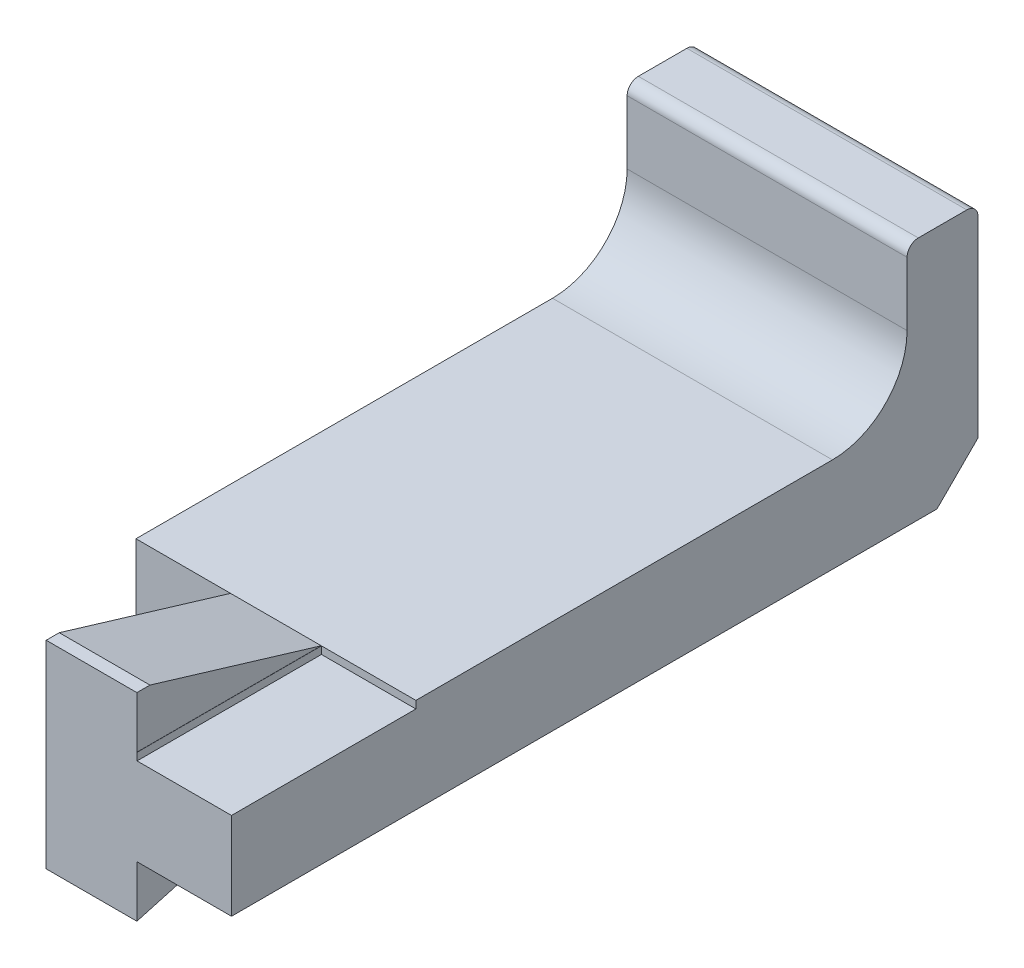
ISO-10303-21;
HEADER;
FILE_DESCRIPTION(('STEP AP214'),'2;1');
FILE_NAME('part.step','',(''),(''),'','','');
FILE_SCHEMA(('AUTOMOTIVE_DESIGN { 1 0 10303 214 1 1 1 1 }'));
ENDSEC;
DATA;
#1=APPLICATION_CONTEXT('core data for automotive mechanical design processes');
#2=APPLICATION_PROTOCOL_DEFINITION('international standard','automotive_design',2000,#1);
#3=PRODUCT_CONTEXT('',#1,'mechanical');
#4=PRODUCT('Part','Part','',(#3));
#5=PRODUCT_RELATED_PRODUCT_CATEGORY('part','',(#4));
#6=PRODUCT_DEFINITION_FORMATION('','',#4);
#7=PRODUCT_DEFINITION_CONTEXT('part definition',#1,'design');
#8=PRODUCT_DEFINITION('design','',#6,#7);
#9=PRODUCT_DEFINITION_SHAPE('','',#8);
#10=(LENGTH_UNIT() NAMED_UNIT(*) SI_UNIT(.MILLI.,.METRE.));
#11=(NAMED_UNIT(*) PLANE_ANGLE_UNIT() SI_UNIT($,.RADIAN.));
#12=(NAMED_UNIT(*) SI_UNIT($,.STERADIAN.) SOLID_ANGLE_UNIT());
#13=UNCERTAINTY_MEASURE_WITH_UNIT(LENGTH_MEASURE(1.E-05),#10,'distance_accuracy_value','');
#14=(GEOMETRIC_REPRESENTATION_CONTEXT(3) GLOBAL_UNCERTAINTY_ASSIGNED_CONTEXT((#13)) GLOBAL_UNIT_ASSIGNED_CONTEXT((#10,
#11,#12)) REPRESENTATION_CONTEXT('',''));
#15=CARTESIAN_POINT('',(0.,0.,0.));
#16=DIRECTION('',(0.,0.,1.));
#17=DIRECTION('',(1.,0.,0.));
#18=AXIS2_PLACEMENT_3D('',#15,#16,#17);
#19=CARTESIAN_POINT('',(-3.0988,6.4516,0.));
#20=DIRECTION('',(-1.,0.,0.));
#21=DIRECTION('',(0.,0.,1.));
#22=AXIS2_PLACEMENT_3D('',#19,#20,#21);
#23=PLANE('',#22);
#24=DIRECTION('',(0.,0.,-1.));
#25=VECTOR('',#24,1.);
#26=CARTESIAN_POINT('',(-3.0988,0.,0.));
#27=LINE('',#26,#25);
#28=CARTESIAN_POINT('',(-3.0988,0.,25.4));
#29=VERTEX_POINT('',#28);
#30=CARTESIAN_POINT('',(-3.0988,0.,12.8524));
#31=VERTEX_POINT('',#30);
#32=EDGE_CURVE('E450',#29,#31,#27,.T.);
#33=ORIENTED_EDGE('',*,*,#32,.F.);
#34=DIRECTION('',(0.,-1.,0.));
#35=VECTOR('',#34,1.);
#36=CARTESIAN_POINT('',(-3.0988,6.4516,25.4));
#37=LINE('',#36,#35);
#38=CARTESIAN_POINT('',(-3.0988,6.4516,25.4));
#39=VERTEX_POINT('',#38);
#40=EDGE_CURVE('E506',#39,#29,#37,.T.);
#41=ORIENTED_EDGE('',*,*,#40,.F.);
#42=DIRECTION('',(0.,0.,-1.));
#43=VECTOR('',#42,1.);
#44=CARTESIAN_POINT('',(-3.0988,6.4516,0.));
#45=LINE('',#44,#43);
#46=CARTESIAN_POINT('',(-3.0988,6.4516,12.8524));
#47=VERTEX_POINT('',#46);
#48=EDGE_CURVE('E451',#39,#47,#45,.T.);
#49=ORIENTED_EDGE('',*,*,#48,.T.);
#50=DIRECTION('',(0.,-1.,0.));
#51=VECTOR('',#50,1.);
#52=CARTESIAN_POINT('',(-3.0988,6.4516,12.8524));
#53=LINE('',#52,#51);
#54=EDGE_CURVE('E471',#47,#31,#53,.T.);
#55=ORIENTED_EDGE('',*,*,#54,.T.);
#56=EDGE_LOOP('',(#33,#41,#49,#55));
#57=FACE_BOUND('',#56,.T.);
#58=ADVANCED_FACE('F43',(#57),#23,.T.);
#59=CARTESIAN_POINT('',(0.,6.4516,25.4));
#60=DIRECTION('',(0.,0.,-1.));
#61=DIRECTION('',(-1.,0.,0.));
#62=AXIS2_PLACEMENT_3D('',#59,#60,#61);
#63=PLANE('',#62);
#64=DIRECTION('',(1.,0.,0.));
#65=VECTOR('',#64,1.);
#66=CARTESIAN_POINT('',(9.525,5.9436,25.4));
#67=LINE('',#66,#65);
#68=CARTESIAN_POINT('',(3.0988,5.9436,25.4));
#69=VERTEX_POINT('',#68);
#70=CARTESIAN_POINT('',(9.525,5.9436,25.4));
#71=VERTEX_POINT('',#70);
#72=EDGE_CURVE('E417',#69,#71,#67,.T.);
#73=ORIENTED_EDGE('',*,*,#72,.F.);
#74=DIRECTION('',(0.,1.,0.));
#75=VECTOR('',#74,1.);
#76=CARTESIAN_POINT('',(3.0988,5.9436,25.4));
#77=LINE('',#76,#75);
#78=CARTESIAN_POINT('',(3.0988,6.4516,25.4));
#79=VERTEX_POINT('',#78);
#80=EDGE_CURVE('E427',#69,#79,#77,.T.);
#81=ORIENTED_EDGE('',*,*,#80,.T.);
#82=DIRECTION('',(1.,0.,0.));
#83=VECTOR('',#82,1.);
#84=CARTESIAN_POINT('',(0.,6.4516,25.4));
#85=LINE('',#84,#83);
#86=CARTESIAN_POINT('',(3.0861,6.4516,25.4));
#87=VERTEX_POINT('',#86);
#88=EDGE_CURVE('E455',#87,#79,#85,.T.);
#89=ORIENTED_EDGE('',*,*,#88,.F.);
#90=DIRECTION('',(0.,-1.,0.));
#91=VECTOR('',#90,1.);
#92=CARTESIAN_POINT('',(3.0861,9.96315,25.4));
#93=LINE('',#92,#91);
#94=CARTESIAN_POINT('',(3.0861,9.96315,25.4));
#95=VERTEX_POINT('',#94);
#96=EDGE_CURVE('E366',#95,#87,#93,.T.);
#97=ORIENTED_EDGE('',*,*,#96,.F.);
#98=DIRECTION('',(-1.,0.,0.));
#99=VECTOR('',#98,1.);
#100=CARTESIAN_POINT('',(3.0861,9.96315,25.4));
#101=LINE('',#100,#99);
#102=CARTESIAN_POINT('',(-3.0861,9.96315,25.4));
#103=VERTEX_POINT('',#102);
#104=EDGE_CURVE('E379',#95,#103,#101,.T.);
#105=ORIENTED_EDGE('',*,*,#104,.T.);
#106=DIRECTION('',(0.,-1.,0.));
#107=VECTOR('',#106,1.);
#108=CARTESIAN_POINT('',(-3.0861,9.96315,25.4));
#109=LINE('',#108,#107);
#110=CARTESIAN_POINT('',(-3.0861,6.4516,25.4));
#111=VERTEX_POINT('',#110);
#112=EDGE_CURVE('E365',#103,#111,#109,.T.);
#113=ORIENTED_EDGE('',*,*,#112,.T.);
#114=EDGE_CURVE('E457',#39,#111,#85,.T.);
#115=ORIENTED_EDGE('',*,*,#114,.F.);
#116=ORIENTED_EDGE('',*,*,#40,.T.);
#117=DIRECTION('',(1.,0.,0.));
#118=VECTOR('',#117,1.);
#119=CARTESIAN_POINT('',(0.,0.,25.4));
#120=LINE('',#119,#118);
#121=CARTESIAN_POINT('',(-3.0861,0.,25.4));
#122=VERTEX_POINT('',#121);
#123=EDGE_CURVE('E476',#29,#122,#120,.T.);
#124=ORIENTED_EDGE('',*,*,#123,.T.);
#125=DIRECTION('',(0.,-1.,0.));
#126=VECTOR('',#125,1.);
#127=CARTESIAN_POINT('',(-3.0861,0.,25.4));
#128=LINE('',#127,#126);
#129=CARTESIAN_POINT('',(-3.0861,-3.51155,25.4));
#130=VERTEX_POINT('',#129);
#131=EDGE_CURVE('E352',#122,#130,#128,.T.);
#132=ORIENTED_EDGE('',*,*,#131,.T.);
#133=DIRECTION('',(-1.,0.,0.));
#134=VECTOR('',#133,1.);
#135=CARTESIAN_POINT('',(3.0861,-3.51155,25.4));
#136=LINE('',#135,#134);
#137=CARTESIAN_POINT('',(3.0861,-3.51155,25.4));
#138=VERTEX_POINT('',#137);
#139=EDGE_CURVE('E361',#138,#130,#136,.T.);
#140=ORIENTED_EDGE('',*,*,#139,.F.);
#141=DIRECTION('',(0.,-1.,0.));
#142=VECTOR('',#141,1.);
#143=CARTESIAN_POINT('',(3.0861,0.,25.4));
#144=LINE('',#143,#142);
#145=CARTESIAN_POINT('',(3.0861,0.,25.4));
#146=VERTEX_POINT('',#145);
#147=EDGE_CURVE('E341',#146,#138,#144,.T.);
#148=ORIENTED_EDGE('',*,*,#147,.F.);
#149=CARTESIAN_POINT('',(9.525,0.,25.4));
#150=VERTEX_POINT('',#149);
#151=EDGE_CURVE('E475',#146,#150,#120,.T.);
#152=ORIENTED_EDGE('',*,*,#151,.T.);
#153=DIRECTION('',(0.,-1.,0.));
#154=VECTOR('',#153,1.);
#155=CARTESIAN_POINT('',(9.525,6.4516,25.4));
#156=LINE('',#155,#154);
#157=EDGE_CURVE('E502',#71,#150,#156,.T.);
#158=ORIENTED_EDGE('',*,*,#157,.F.);
#159=EDGE_LOOP('',(#73,#81,#89,#97,#105,#113,#115,#116,#124,#132,#140,#148,#152,#158));
#160=FACE_BOUND('',#159,.T.);
#161=ADVANCED_FACE('F563',(#160),#63,.F.);
#162=CARTESIAN_POINT('',(9.525,6.4516,0.));
#163=DIRECTION('',(-1.,0.,0.));
#164=DIRECTION('',(0.,0.,1.));
#165=AXIS2_PLACEMENT_3D('',#162,#163,#164);
#166=PLANE('',#165);
#167=DIRECTION('',(0.,0.,-1.));
#168=VECTOR('',#167,1.);
#169=CARTESIAN_POINT('',(9.525,0.,0.));
#170=LINE('',#169,#168);
#171=CARTESIAN_POINT('',(9.525,0.,-22.606));
#172=VERTEX_POINT('',#171);
#173=EDGE_CURVE('E480',#150,#172,#170,.T.);
#174=ORIENTED_EDGE('',*,*,#173,.T.);
#175=DIRECTION('',(0.,0.707106781186549,-0.707106781186546));
#176=VECTOR('',#175,1.);
#177=CARTESIAN_POINT('',(9.525,0.,-22.606));
#178=LINE('',#177,#176);
#179=CARTESIAN_POINT('',(9.525,2.794,-25.4));
#180=VERTEX_POINT('',#179);
#181=EDGE_CURVE('E554',#172,#180,#178,.T.);
#182=ORIENTED_EDGE('',*,*,#181,.T.);
#183=DIRECTION('',(0.,-1.,0.));
#184=VECTOR('',#183,1.);
#185=CARTESIAN_POINT('',(9.525,6.4516,-25.4));
#186=LINE('',#185,#184);
#187=CARTESIAN_POINT('',(9.525,15.8496,-25.4));
#188=VERTEX_POINT('',#187);
#189=EDGE_CURVE('E499',#188,#180,#186,.T.);
#190=ORIENTED_EDGE('',*,*,#189,.F.);
#191=CARTESIAN_POINT('',(9.525,15.8496,-24.638));
#192=DIRECTION('',(-1.,0.,0.));
#193=DIRECTION('',(0.,0.,1.));
#194=AXIS2_PLACEMENT_3D('',#191,#192,#193);
#195=CIRCLE('',#194,0.762);
#196=CARTESIAN_POINT('',(9.525,16.6116,-24.638));
#197=VERTEX_POINT('',#196);
#198=EDGE_CURVE('E544',#188,#197,#195,.F.);
#199=ORIENTED_EDGE('',*,*,#198,.T.);
#200=DIRECTION('',(0.,0.,-1.));
#201=VECTOR('',#200,1.);
#202=CARTESIAN_POINT('',(9.525,16.6116,-25.4));
#203=LINE('',#202,#201);
#204=CARTESIAN_POINT('',(9.525,16.6116,-21.336));
#205=VERTEX_POINT('',#204);
#206=EDGE_CURVE('E440',#205,#197,#203,.T.);
#207=ORIENTED_EDGE('',*,*,#206,.F.);
#208=CARTESIAN_POINT('',(9.525,15.8496,-21.336));
#209=DIRECTION('',(-1.,0.,0.));
#210=DIRECTION('',(0.,0.,1.));
#211=AXIS2_PLACEMENT_3D('',#208,#209,#210);
#212=CIRCLE('',#211,0.762);
#213=CARTESIAN_POINT('',(9.525,15.8496,-20.574));
#214=VERTEX_POINT('',#213);
#215=EDGE_CURVE('E541',#205,#214,#212,.F.);
#216=ORIENTED_EDGE('',*,*,#215,.T.);
#217=DIRECTION('',(0.,-1.,0.));
#218=VECTOR('',#217,1.);
#219=CARTESIAN_POINT('',(9.525,16.6116,-20.574));
#220=LINE('',#219,#218);
#221=CARTESIAN_POINT('',(9.525,11.5316,-20.574));
#222=VERTEX_POINT('',#221);
#223=EDGE_CURVE('E444',#214,#222,#220,.T.);
#224=ORIENTED_EDGE('',*,*,#223,.T.);
#225=CARTESIAN_POINT('',(9.525,11.5316,-15.494));
#226=DIRECTION('',(-1.,0.,0.));
#227=DIRECTION('',(0.,0.,1.));
#228=AXIS2_PLACEMENT_3D('',#225,#226,#227);
#229=CIRCLE('',#228,5.08);
#230=CARTESIAN_POINT('',(9.525,6.4516,-15.494));
#231=VERTEX_POINT('',#230);
#232=EDGE_CURVE('E516',#222,#231,#229,.T.);
#233=ORIENTED_EDGE('',*,*,#232,.T.);
#234=DIRECTION('',(0.,0.,-1.));
#235=VECTOR('',#234,1.);
#236=CARTESIAN_POINT('',(9.525,6.4516,0.));
#237=LINE('',#236,#235);
#238=CARTESIAN_POINT('',(9.525,6.4516,12.8524));
#239=VERTEX_POINT('',#238);
#240=EDGE_CURVE('E461',#239,#231,#237,.T.);
#241=ORIENTED_EDGE('',*,*,#240,.F.);
#242=DIRECTION('',(0.,1.,0.));
#243=VECTOR('',#242,1.);
#244=CARTESIAN_POINT('',(9.525,5.9436,12.8524));
#245=LINE('',#244,#243);
#246=CARTESIAN_POINT('',(9.525,5.9436,12.8524));
#247=VERTEX_POINT('',#246);
#248=EDGE_CURVE('E420',#247,#239,#245,.T.);
#249=ORIENTED_EDGE('',*,*,#248,.F.);
#250=DIRECTION('',(0.,0.,-1.));
#251=VECTOR('',#250,1.);
#252=CARTESIAN_POINT('',(9.525,5.9436,25.4));
#253=LINE('',#252,#251);
#254=EDGE_CURVE('E404',#71,#247,#253,.T.);
#255=ORIENTED_EDGE('',*,*,#254,.F.);
#256=ORIENTED_EDGE('',*,*,#157,.T.);
#257=EDGE_LOOP('',(#174,#182,#190,#199,#207,#216,#224,#233,#241,#249,#255,#256));
#258=FACE_BOUND('',#257,.T.);
#259=ADVANCED_FACE('F570',(#258),#166,.F.);
#260=CARTESIAN_POINT('',(0.,6.4516,-25.4));
#261=DIRECTION('',(0.,0.,-1.));
#262=DIRECTION('',(-1.,0.,0.));
#263=AXIS2_PLACEMENT_3D('',#260,#261,#262);
#264=PLANE('',#263);
#265=ORIENTED_EDGE('',*,*,#189,.T.);
#266=DIRECTION('',(-1.,0.,0.));
#267=VECTOR('',#266,1.);
#268=CARTESIAN_POINT('',(-9.525,2.794,-25.4));
#269=LINE('',#268,#267);
#270=CARTESIAN_POINT('',(-9.525,2.794,-25.4));
#271=VERTEX_POINT('',#270);
#272=EDGE_CURVE('E53',#180,#271,#269,.T.);
#273=ORIENTED_EDGE('',*,*,#272,.T.);
#274=DIRECTION('',(0.,-1.,0.));
#275=VECTOR('',#274,1.);
#276=CARTESIAN_POINT('',(-9.525,6.4516,-25.4));
#277=LINE('',#276,#275);
#278=CARTESIAN_POINT('',(-9.525,15.8496,-25.4));
#279=VERTEX_POINT('',#278);
#280=EDGE_CURVE('E496',#279,#271,#277,.T.);
#281=ORIENTED_EDGE('',*,*,#280,.F.);
#282=DIRECTION('',(-1.,0.,0.));
#283=VECTOR('',#282,1.);
#284=CARTESIAN_POINT('',(0.,15.8496,-25.4));
#285=LINE('',#284,#283);
#286=EDGE_CURVE('E538',#279,#188,#285,.F.);
#287=ORIENTED_EDGE('',*,*,#286,.T.);
#288=EDGE_LOOP('',(#265,#273,#281,#287));
#289=FACE_BOUND('',#288,.T.);
#290=ADVANCED_FACE('F580',(#289),#264,.T.);
#291=CARTESIAN_POINT('',(-9.525,6.4516,0.));
#292=DIRECTION('',(-1.,0.,0.));
#293=DIRECTION('',(0.,0.,1.));
#294=AXIS2_PLACEMENT_3D('',#291,#292,#293);
#295=PLANE('',#294);
#296=ORIENTED_EDGE('',*,*,#280,.T.);
#297=DIRECTION('',(0.,-0.707106781186549,0.707106781186546));
#298=VECTOR('',#297,1.);
#299=CARTESIAN_POINT('',(-9.525,-8.07719999999999,-14.5288000000001));
#300=LINE('',#299,#298);
#301=CARTESIAN_POINT('',(-9.525,0.,-22.606));
#302=VERTEX_POINT('',#301);
#303=EDGE_CURVE('E11',#271,#302,#300,.T.);
#304=ORIENTED_EDGE('',*,*,#303,.T.);
#305=DIRECTION('',(0.,0.,-1.));
#306=VECTOR('',#305,1.);
#307=CARTESIAN_POINT('',(-9.525,0.,0.));
#308=LINE('',#307,#306);
#309=CARTESIAN_POINT('',(-9.525,0.,12.8524));
#310=VERTEX_POINT('',#309);
#311=EDGE_CURVE('E484',#310,#302,#308,.T.);
#312=ORIENTED_EDGE('',*,*,#311,.F.);
#313=DIRECTION('',(0.,-1.,0.));
#314=VECTOR('',#313,1.);
#315=CARTESIAN_POINT('',(-9.525,6.4516,12.8524));
#316=LINE('',#315,#314);
#317=CARTESIAN_POINT('',(-9.525,6.4516,12.8524));
#318=VERTEX_POINT('',#317);
#319=EDGE_CURVE('E493',#318,#310,#316,.T.);
#320=ORIENTED_EDGE('',*,*,#319,.F.);
#321=DIRECTION('',(0.,0.,-1.));
#322=VECTOR('',#321,1.);
#323=CARTESIAN_POINT('',(-9.525,6.4516,0.));
#324=LINE('',#323,#322);
#325=CARTESIAN_POINT('',(-9.525,6.4516,-15.494));
#326=VERTEX_POINT('',#325);
#327=EDGE_CURVE('E464',#318,#326,#324,.T.);
#328=ORIENTED_EDGE('',*,*,#327,.T.);
#329=CARTESIAN_POINT('',(-9.525,11.5316,-15.494));
#330=DIRECTION('',(-1.,0.,0.));
#331=DIRECTION('',(0.,0.,1.));
#332=AXIS2_PLACEMENT_3D('',#329,#330,#331);
#333=CIRCLE('',#332,5.08);
#334=CARTESIAN_POINT('',(-9.525,11.5316,-20.574));
#335=VERTEX_POINT('',#334);
#336=EDGE_CURVE('E520',#326,#335,#333,.F.);
#337=ORIENTED_EDGE('',*,*,#336,.T.);
#338=DIRECTION('',(0.,-1.,0.));
#339=VECTOR('',#338,1.);
#340=CARTESIAN_POINT('',(-9.525,16.6116,-20.574));
#341=LINE('',#340,#339);
#342=CARTESIAN_POINT('',(-9.525,15.8496,-20.574));
#343=VERTEX_POINT('',#342);
#344=EDGE_CURVE('E447',#343,#335,#341,.T.);
#345=ORIENTED_EDGE('',*,*,#344,.F.);
#346=CARTESIAN_POINT('',(-9.525,15.8496,-21.336));
#347=DIRECTION('',(-1.,0.,0.));
#348=DIRECTION('',(0.,0.,1.));
#349=AXIS2_PLACEMENT_3D('',#346,#347,#348);
#350=CIRCLE('',#349,0.762);
#351=CARTESIAN_POINT('',(-9.525,16.6116,-21.336));
#352=VERTEX_POINT('',#351);
#353=EDGE_CURVE('E532',#343,#352,#350,.T.);
#354=ORIENTED_EDGE('',*,*,#353,.T.);
#355=DIRECTION('',(0.,0.,1.));
#356=VECTOR('',#355,1.);
#357=CARTESIAN_POINT('',(-9.525,16.6116,-25.4));
#358=LINE('',#357,#356);
#359=CARTESIAN_POINT('',(-9.525,16.6116,-24.638));
#360=VERTEX_POINT('',#359);
#361=EDGE_CURVE('E431',#360,#352,#358,.T.);
#362=ORIENTED_EDGE('',*,*,#361,.F.);
#363=CARTESIAN_POINT('',(-9.525,15.8496,-24.638));
#364=DIRECTION('',(-1.,0.,0.));
#365=DIRECTION('',(0.,0.,1.));
#366=AXIS2_PLACEMENT_3D('',#363,#364,#365);
#367=CIRCLE('',#366,0.762);
#368=EDGE_CURVE('E535',#360,#279,#367,.T.);
#369=ORIENTED_EDGE('',*,*,#368,.T.);
#370=EDGE_LOOP('',(#296,#304,#312,#320,#328,#337,#345,#354,#362,#369));
#371=FACE_BOUND('',#370,.T.);
#372=ADVANCED_FACE('F777',(#371),#295,.T.);
#373=CARTESIAN_POINT('',(0.,6.4516,12.8524));
#374=DIRECTION('',(0.,0.,-1.));
#375=DIRECTION('',(-1.,0.,0.));
#376=AXIS2_PLACEMENT_3D('',#373,#374,#375);
#377=PLANE('',#376);
#378=DIRECTION('',(1.,0.,0.));
#379=VECTOR('',#378,1.);
#380=CARTESIAN_POINT('',(0.,0.,12.8524));
#381=LINE('',#380,#379);
#382=EDGE_CURVE('E456',#310,#31,#381,.T.);
#383=ORIENTED_EDGE('',*,*,#382,.T.);
#384=ORIENTED_EDGE('',*,*,#54,.F.);
#385=DIRECTION('',(1.,0.,0.));
#386=VECTOR('',#385,1.);
#387=CARTESIAN_POINT('',(0.,6.4516,12.8524));
#388=LINE('',#387,#386);
#389=EDGE_CURVE('E468',#318,#47,#388,.T.);
#390=ORIENTED_EDGE('',*,*,#389,.F.);
#391=ORIENTED_EDGE('',*,*,#319,.T.);
#392=EDGE_LOOP('',(#383,#384,#390,#391));
#393=FACE_BOUND('',#392,.T.);
#394=ADVANCED_FACE('F688',(#393),#377,.F.);
#395=CARTESIAN_POINT('',(0.,6.4516,0.));
#396=DIRECTION('',(0.,1.,0.));
#397=DIRECTION('',(0.,0.,1.));
#398=AXIS2_PLACEMENT_3D('',#395,#396,#397);
#399=PLANE('',#398);
#400=DIRECTION('',(0.,0.,-1.));
#401=VECTOR('',#400,1.);
#402=CARTESIAN_POINT('',(3.0861,6.4516,25.4));
#403=LINE('',#402,#401);
#404=CARTESIAN_POINT('',(3.0861,6.4516,12.8524));
#405=VERTEX_POINT('',#404);
#406=EDGE_CURVE('E369',#87,#405,#403,.T.);
#407=ORIENTED_EDGE('',*,*,#406,.F.);
#408=ORIENTED_EDGE('',*,*,#88,.T.);
#409=DIRECTION('',(0.,0.,1.));
#410=VECTOR('',#409,1.);
#411=CARTESIAN_POINT('',(3.0988,6.4516,25.4));
#412=LINE('',#411,#410);
#413=CARTESIAN_POINT('',(3.0988,6.4516,12.8524));
#414=VERTEX_POINT('',#413);
#415=EDGE_CURVE('E409',#414,#79,#412,.T.);
#416=ORIENTED_EDGE('',*,*,#415,.F.);
#417=DIRECTION('',(-1.,0.,0.));
#418=VECTOR('',#417,1.);
#419=CARTESIAN_POINT('',(9.525,6.4516,12.8524));
#420=LINE('',#419,#418);
#421=EDGE_CURVE('E403',#239,#414,#420,.T.);
#422=ORIENTED_EDGE('',*,*,#421,.F.);
#423=ORIENTED_EDGE('',*,*,#240,.T.);
#424=DIRECTION('',(1.,0.,0.));
#425=VECTOR('',#424,1.);
#426=CARTESIAN_POINT('',(0.,6.4516,-15.494));
#427=LINE('',#426,#425);
#428=EDGE_CURVE('E513',#231,#326,#427,.F.);
#429=ORIENTED_EDGE('',*,*,#428,.T.);
#430=ORIENTED_EDGE('',*,*,#327,.F.);
#431=ORIENTED_EDGE('',*,*,#389,.T.);
#432=ORIENTED_EDGE('',*,*,#48,.F.);
#433=ORIENTED_EDGE('',*,*,#114,.T.);
#434=DIRECTION('',(0.,0.,-1.));
#435=VECTOR('',#434,1.);
#436=CARTESIAN_POINT('',(-3.0861,6.4516,25.4));
#437=LINE('',#436,#435);
#438=CARTESIAN_POINT('',(-3.0861,6.4516,12.8524));
#439=VERTEX_POINT('',#438);
#440=EDGE_CURVE('E383',#111,#439,#437,.T.);
#441=ORIENTED_EDGE('',*,*,#440,.T.);
#442=DIRECTION('',(-1.,0.,0.));
#443=VECTOR('',#442,1.);
#444=CARTESIAN_POINT('',(3.0861,6.4516,12.8524));
#445=LINE('',#444,#443);
#446=EDGE_CURVE('E399',#405,#439,#445,.T.);
#447=ORIENTED_EDGE('',*,*,#446,.F.);
#448=EDGE_LOOP('',(#407,#408,#416,#422,#423,#429,#430,#431,#432,#433,#441,#447));
#449=FACE_BOUND('',#448,.T.);
#450=ADVANCED_FACE('F608',(#449),#399,.T.);
#451=CARTESIAN_POINT('',(0.,0.,0.));
#452=DIRECTION('',(0.,1.,0.));
#453=DIRECTION('',(0.,0.,1.));
#454=AXIS2_PLACEMENT_3D('',#451,#452,#453);
#455=PLANE('',#454);
#456=DIRECTION('',(-1.,0.,0.));
#457=VECTOR('',#456,1.);
#458=CARTESIAN_POINT('',(-3.175,0.,1.27313602063659));
#459=LINE('',#458,#457);
#460=CARTESIAN_POINT('',(3.175,0.,1.27313602063659));
#461=VERTEX_POINT('',#460);
#462=CARTESIAN_POINT('',(-3.175,0.,1.27313602063659));
#463=VERTEX_POINT('',#462);
#464=EDGE_CURVE('E294',#461,#463,#459,.T.);
#465=ORIENTED_EDGE('',*,*,#464,.F.);
#466=DIRECTION('',(0.,0.,-1.));
#467=VECTOR('',#466,1.);
#468=CARTESIAN_POINT('',(3.175,0.,1.27313602063659));
#469=LINE('',#468,#467);
#470=CARTESIAN_POINT('',(3.175,0.,23.8516788807721));
#471=VERTEX_POINT('',#470);
#472=EDGE_CURVE('E60',#471,#461,#469,.T.);
#473=ORIENTED_EDGE('',*,*,#472,.F.);
#474=DIRECTION('',(-1.,0.,0.));
#475=VECTOR('',#474,1.);
#476=CARTESIAN_POINT('',(3.175,0.,23.8516788807721));
#477=LINE('',#476,#475);
#478=CARTESIAN_POINT('',(7.239,0.,23.8516788807721));
#479=VERTEX_POINT('',#478);
#480=EDGE_CURVE('E266',#479,#471,#477,.T.);
#481=ORIENTED_EDGE('',*,*,#480,.F.);
#482=DIRECTION('',(0.,0.,1.));
#483=VECTOR('',#482,1.);
#484=CARTESIAN_POINT('',(7.239,0.,23.8516788807721));
#485=LINE('',#484,#483);
#486=CARTESIAN_POINT('',(7.239,0.,-21.9964));
#487=VERTEX_POINT('',#486);
#488=EDGE_CURVE('E270',#487,#479,#485,.T.);
#489=ORIENTED_EDGE('',*,*,#488,.F.);
#490=DIRECTION('',(1.,0.,0.));
#491=VECTOR('',#490,1.);
#492=CARTESIAN_POINT('',(7.239,0.,-21.9964));
#493=LINE('',#492,#491);
#494=CARTESIAN_POINT('',(-7.239,0.,-21.9964));
#495=VERTEX_POINT('',#494);
#496=EDGE_CURVE('E309',#495,#487,#493,.T.);
#497=ORIENTED_EDGE('',*,*,#496,.F.);
#498=DIRECTION('',(0.,0.,-1.));
#499=VECTOR('',#498,1.);
#500=CARTESIAN_POINT('',(-7.239,0.,-21.9964));
#501=LINE('',#500,#499);
#502=CARTESIAN_POINT('',(-7.239,0.,10.7029980386932));
#503=VERTEX_POINT('',#502);
#504=EDGE_CURVE('E305',#503,#495,#501,.T.);
#505=ORIENTED_EDGE('',*,*,#504,.F.);
#506=DIRECTION('',(-1.,0.,0.));
#507=VECTOR('',#506,1.);
#508=CARTESIAN_POINT('',(-7.239,0.,10.7029980386932));
#509=LINE('',#508,#507);
#510=CARTESIAN_POINT('',(-3.175,0.,10.7029980386932));
#511=VERTEX_POINT('',#510);
#512=EDGE_CURVE('E301',#511,#503,#509,.T.);
#513=ORIENTED_EDGE('',*,*,#512,.F.);
#514=DIRECTION('',(0.,0.,1.));
#515=VECTOR('',#514,1.);
#516=CARTESIAN_POINT('',(-3.175,0.,10.7029980386932));
#517=LINE('',#516,#515);
#518=EDGE_CURVE('E297',#463,#511,#517,.T.);
#519=ORIENTED_EDGE('',*,*,#518,.F.);
#520=EDGE_LOOP('',(#465,#473,#481,#489,#497,#505,#513,#519));
#521=FACE_BOUND('',#520,.T.);
#522=ORIENTED_EDGE('',*,*,#311,.T.);
#523=DIRECTION('',(1.,0.,0.));
#524=VECTOR('',#523,1.);
#525=CARTESIAN_POINT('',(9.525,0.,-22.606));
#526=LINE('',#525,#524);
#527=EDGE_CURVE('E550',#302,#172,#526,.T.);
#528=ORIENTED_EDGE('',*,*,#527,.T.);
#529=ORIENTED_EDGE('',*,*,#173,.F.);
#530=ORIENTED_EDGE('',*,*,#151,.F.);
#531=DIRECTION('',(0.,0.,1.));
#532=VECTOR('',#531,1.);
#533=CARTESIAN_POINT('',(3.0861,0.,12.8524));
#534=LINE('',#533,#532);
#535=CARTESIAN_POINT('',(3.0861,0.,12.8524));
#536=VERTEX_POINT('',#535);
#537=EDGE_CURVE('E337',#536,#146,#534,.T.);
#538=ORIENTED_EDGE('',*,*,#537,.F.);
#539=DIRECTION('',(-1.,0.,0.));
#540=VECTOR('',#539,1.);
#541=CARTESIAN_POINT('',(3.0861,0.,12.8524));
#542=LINE('',#541,#540);
#543=CARTESIAN_POINT('',(-3.0861,0.,12.8524));
#544=VERTEX_POINT('',#543);
#545=EDGE_CURVE('E348',#536,#544,#542,.T.);
#546=ORIENTED_EDGE('',*,*,#545,.T.);
#547=DIRECTION('',(0.,0.,1.));
#548=VECTOR('',#547,1.);
#549=CARTESIAN_POINT('',(-3.0861,0.,12.8524));
#550=LINE('',#549,#548);
#551=EDGE_CURVE('E319',#544,#122,#550,.T.);
#552=ORIENTED_EDGE('',*,*,#551,.T.);
#553=ORIENTED_EDGE('',*,*,#123,.F.);
#554=ORIENTED_EDGE('',*,*,#32,.T.);
#555=ORIENTED_EDGE('',*,*,#382,.F.);
#556=EDGE_LOOP('',(#522,#528,#529,#530,#538,#546,#552,#553,#554,#555));
#557=FACE_BOUND('',#556,.T.);
#558=ADVANCED_FACE('F572',(#521,#557),#455,.F.);
#559=CARTESIAN_POINT('',(-9.525,16.6116,-20.574));
#560=DIRECTION('',(0.,0.,-1.));
#561=DIRECTION('',(-1.,0.,0.));
#562=AXIS2_PLACEMENT_3D('',#559,#560,#561);
#563=PLANE('',#562);
#564=ORIENTED_EDGE('',*,*,#223,.F.);
#565=DIRECTION('',(1.,0.,0.));
#566=VECTOR('',#565,1.);
#567=CARTESIAN_POINT('',(-9.525,15.8496,-20.574));
#568=LINE('',#567,#566);
#569=EDGE_CURVE('E547',#214,#343,#568,.F.);
#570=ORIENTED_EDGE('',*,*,#569,.T.);
#571=ORIENTED_EDGE('',*,*,#344,.T.);
#572=DIRECTION('',(1.,0.,0.));
#573=VECTOR('',#572,1.);
#574=CARTESIAN_POINT('',(-9.525,11.5316,-20.574));
#575=LINE('',#574,#573);
#576=EDGE_CURVE('E509',#335,#222,#575,.T.);
#577=ORIENTED_EDGE('',*,*,#576,.T.);
#578=EDGE_LOOP('',(#564,#570,#571,#577));
#579=FACE_BOUND('',#578,.T.);
#580=ADVANCED_FACE('F597',(#579),#563,.F.);
#581=CARTESIAN_POINT('',(0.,16.6116,0.));
#582=DIRECTION('',(0.,1.,0.));
#583=DIRECTION('',(0.,0.,1.));
#584=AXIS2_PLACEMENT_3D('',#581,#582,#583);
#585=PLANE('',#584);
#586=ORIENTED_EDGE('',*,*,#206,.T.);
#587=DIRECTION('',(-1.,0.,0.));
#588=VECTOR('',#587,1.);
#589=CARTESIAN_POINT('',(0.,16.6116,-24.638));
#590=LINE('',#589,#588);
#591=EDGE_CURVE('E528',#197,#360,#590,.T.);
#592=ORIENTED_EDGE('',*,*,#591,.T.);
#593=ORIENTED_EDGE('',*,*,#361,.T.);
#594=DIRECTION('',(1.,0.,0.));
#595=VECTOR('',#594,1.);
#596=CARTESIAN_POINT('',(9.525,16.6116,-21.336));
#597=LINE('',#596,#595);
#598=EDGE_CURVE('E524',#352,#205,#597,.T.);
#599=ORIENTED_EDGE('',*,*,#598,.T.);
#600=EDGE_LOOP('',(#586,#592,#593,#599));
#601=FACE_BOUND('',#600,.T.);
#602=ADVANCED_FACE('F587',(#601),#585,.T.);
#603=CARTESIAN_POINT('',(-9.525,11.5316,-15.494));
#604=DIRECTION('',(1.,0.,0.));
#605=DIRECTION('',(0.,0.,-1.));
#606=AXIS2_PLACEMENT_3D('',#603,#604,#605);
#607=CYLINDRICAL_SURFACE('',#606,5.08);
#608=ORIENTED_EDGE('',*,*,#336,.F.);
#609=ORIENTED_EDGE('',*,*,#428,.F.);
#610=ORIENTED_EDGE('',*,*,#232,.F.);
#611=ORIENTED_EDGE('',*,*,#576,.F.);
#612=EDGE_LOOP('',(#608,#609,#610,#611));
#613=FACE_BOUND('',#612,.T.);
#614=ADVANCED_FACE('F602',(#613),#607,.F.);
#615=CARTESIAN_POINT('',(0.,15.8496,-24.638));
#616=DIRECTION('',(-1.,0.,0.));
#617=DIRECTION('',(0.,0.,1.));
#618=AXIS2_PLACEMENT_3D('',#615,#616,#617);
#619=CYLINDRICAL_SURFACE('',#618,0.762);
#620=ORIENTED_EDGE('',*,*,#198,.F.);
#621=ORIENTED_EDGE('',*,*,#286,.F.);
#622=ORIENTED_EDGE('',*,*,#368,.F.);
#623=ORIENTED_EDGE('',*,*,#591,.F.);
#624=EDGE_LOOP('',(#620,#621,#622,#623));
#625=FACE_BOUND('',#624,.T.);
#626=ADVANCED_FACE('F583',(#625),#619,.T.);
#627=CARTESIAN_POINT('',(0.,15.8496,-21.336));
#628=DIRECTION('',(-1.,0.,0.));
#629=DIRECTION('',(0.,0.,1.));
#630=AXIS2_PLACEMENT_3D('',#627,#628,#629);
#631=CYLINDRICAL_SURFACE('',#630,0.762);
#632=ORIENTED_EDGE('',*,*,#353,.F.);
#633=ORIENTED_EDGE('',*,*,#569,.F.);
#634=ORIENTED_EDGE('',*,*,#215,.F.);
#635=ORIENTED_EDGE('',*,*,#598,.F.);
#636=EDGE_LOOP('',(#632,#633,#634,#635));
#637=FACE_BOUND('',#636,.T.);
#638=ADVANCED_FACE('F592',(#637),#631,.T.);
#639=CARTESIAN_POINT('',(3.0988,5.9436,25.4));
#640=DIRECTION('',(-1.,0.,0.));
#641=DIRECTION('',(0.,0.,1.));
#642=AXIS2_PLACEMENT_3D('',#639,#640,#641);
#643=PLANE('',#642);
#644=ORIENTED_EDGE('',*,*,#415,.T.);
#645=ORIENTED_EDGE('',*,*,#80,.F.);
#646=DIRECTION('',(0.,0.,1.));
#647=VECTOR('',#646,1.);
#648=CARTESIAN_POINT('',(3.0988,5.9436,25.4));
#649=LINE('',#648,#647);
#650=CARTESIAN_POINT('',(3.0988,5.9436,12.8524));
#651=VERTEX_POINT('',#650);
#652=EDGE_CURVE('E413',#651,#69,#649,.T.);
#653=ORIENTED_EDGE('',*,*,#652,.F.);
#654=DIRECTION('',(0.,1.,0.));
#655=VECTOR('',#654,1.);
#656=CARTESIAN_POINT('',(3.0988,5.9436,12.8524));
#657=LINE('',#656,#655);
#658=EDGE_CURVE('E432',#651,#414,#657,.T.);
#659=ORIENTED_EDGE('',*,*,#658,.T.);
#660=EDGE_LOOP('',(#644,#645,#653,#659));
#661=FACE_BOUND('',#660,.T.);
#662=ADVANCED_FACE('F619',(#661),#643,.F.);
#663=CARTESIAN_POINT('',(9.525,5.9436,12.8524));
#664=DIRECTION('',(0.,0.,-1.));
#665=DIRECTION('',(-1.,0.,0.));
#666=AXIS2_PLACEMENT_3D('',#663,#664,#665);
#667=PLANE('',#666);
#668=ORIENTED_EDGE('',*,*,#421,.T.);
#669=ORIENTED_EDGE('',*,*,#658,.F.);
#670=DIRECTION('',(-1.,0.,0.));
#671=VECTOR('',#670,1.);
#672=CARTESIAN_POINT('',(9.525,5.9436,12.8524));
#673=LINE('',#672,#671);
#674=EDGE_CURVE('E408',#247,#651,#673,.T.);
#675=ORIENTED_EDGE('',*,*,#674,.F.);
#676=ORIENTED_EDGE('',*,*,#248,.T.);
#677=EDGE_LOOP('',(#668,#669,#675,#676));
#678=FACE_BOUND('',#677,.T.);
#679=ADVANCED_FACE('F612',(#678),#667,.F.);
#680=CARTESIAN_POINT('',(0.,5.9436,0.));
#681=DIRECTION('',(0.,1.,0.));
#682=DIRECTION('',(0.,0.,1.));
#683=AXIS2_PLACEMENT_3D('',#680,#681,#682);
#684=PLANE('',#683);
#685=ORIENTED_EDGE('',*,*,#254,.T.);
#686=ORIENTED_EDGE('',*,*,#674,.T.);
#687=ORIENTED_EDGE('',*,*,#652,.T.);
#688=ORIENTED_EDGE('',*,*,#72,.T.);
#689=EDGE_LOOP('',(#685,#686,#687,#688));
#690=FACE_BOUND('',#689,.T.);
#691=ADVANCED_FACE('F615',(#690),#684,.T.);
#692=CARTESIAN_POINT('',(3.0861,6.4516,12.8524));
#693=DIRECTION('',(0.,-0.957509924346337,0.288400320350503));
#694=DIRECTION('',(0.,-0.288400320350503,-0.957509924346337));
#695=AXIS2_PLACEMENT_3D('',#692,#693,#694);
#696=PLANE('',#695);
#697=DIRECTION('',(0.,0.288400320350503,0.957509924346337));
#698=VECTOR('',#697,1.);
#699=CARTESIAN_POINT('',(-3.0861,6.4516,12.8524));
#700=LINE('',#699,#698);
#701=CARTESIAN_POINT('',(-3.0861,9.96315,24.511));
#702=VERTEX_POINT('',#701);
#703=EDGE_CURVE('E387',#439,#702,#700,.T.);
#704=ORIENTED_EDGE('',*,*,#703,.T.);
#705=DIRECTION('',(-1.,0.,0.));
#706=VECTOR('',#705,1.);
#707=CARTESIAN_POINT('',(3.0861,9.96315,24.511));
#708=LINE('',#707,#706);
#709=CARTESIAN_POINT('',(3.0861,9.96315,24.511));
#710=VERTEX_POINT('',#709);
#711=EDGE_CURVE('E395',#710,#702,#708,.T.);
#712=ORIENTED_EDGE('',*,*,#711,.F.);
#713=DIRECTION('',(0.,0.288400320350503,0.957509924346337));
#714=VECTOR('',#713,1.);
#715=CARTESIAN_POINT('',(3.0861,6.4516,12.8524));
#716=LINE('',#715,#714);
#717=EDGE_CURVE('E373',#405,#710,#716,.T.);
#718=ORIENTED_EDGE('',*,*,#717,.F.);
#719=ORIENTED_EDGE('',*,*,#446,.T.);
#720=EDGE_LOOP('',(#704,#712,#718,#719));
#721=FACE_BOUND('',#720,.T.);
#722=ADVANCED_FACE('F670',(#721),#696,.F.);
#723=CARTESIAN_POINT('',(3.0861,9.96315,24.511));
#724=DIRECTION('',(0.,-1.,0.));
#725=DIRECTION('',(0.,0.,-1.));
#726=AXIS2_PLACEMENT_3D('',#723,#724,#725);
#727=PLANE('',#726);
#728=DIRECTION('',(0.,0.,1.));
#729=VECTOR('',#728,1.);
#730=CARTESIAN_POINT('',(-3.0861,9.96315,24.511));
#731=LINE('',#730,#729);
#732=EDGE_CURVE('E370',#702,#103,#731,.T.);
#733=ORIENTED_EDGE('',*,*,#732,.T.);
#734=ORIENTED_EDGE('',*,*,#104,.F.);
#735=DIRECTION('',(0.,0.,1.));
#736=VECTOR('',#735,1.);
#737=CARTESIAN_POINT('',(3.0861,9.96315,24.511));
#738=LINE('',#737,#736);
#739=EDGE_CURVE('E376',#710,#95,#738,.T.);
#740=ORIENTED_EDGE('',*,*,#739,.F.);
#741=ORIENTED_EDGE('',*,*,#711,.T.);
#742=EDGE_LOOP('',(#733,#734,#740,#741));
#743=FACE_BOUND('',#742,.T.);
#744=ADVANCED_FACE('F699',(#743),#727,.F.);
#745=CARTESIAN_POINT('',(3.0861,0.,0.));
#746=DIRECTION('',(1.,0.,0.));
#747=DIRECTION('',(0.,0.,-1.));
#748=AXIS2_PLACEMENT_3D('',#745,#746,#747);
#749=PLANE('',#748);
#750=ORIENTED_EDGE('',*,*,#96,.T.);
#751=ORIENTED_EDGE('',*,*,#406,.T.);
#752=ORIENTED_EDGE('',*,*,#717,.T.);
#753=ORIENTED_EDGE('',*,*,#739,.T.);
#754=EDGE_LOOP('',(#750,#751,#752,#753));
#755=FACE_BOUND('',#754,.T.);
#756=ADVANCED_FACE('F709',(#755),#749,.T.);
#757=CARTESIAN_POINT('',(-3.0861,0.,0.));
#758=DIRECTION('',(1.,0.,0.));
#759=DIRECTION('',(0.,0.,-1.));
#760=AXIS2_PLACEMENT_3D('',#757,#758,#759);
#761=PLANE('',#760);
#762=ORIENTED_EDGE('',*,*,#112,.F.);
#763=ORIENTED_EDGE('',*,*,#732,.F.);
#764=ORIENTED_EDGE('',*,*,#703,.F.);
#765=ORIENTED_EDGE('',*,*,#440,.F.);
#766=EDGE_LOOP('',(#762,#763,#764,#765));
#767=FACE_BOUND('',#766,.T.);
#768=ADVANCED_FACE('F719',(#767),#761,.F.);
#769=CARTESIAN_POINT('',(3.0861,-3.51155,25.4));
#770=DIRECTION('',(0.,0.962999441737105,0.269503386275617));
#771=DIRECTION('',(0.,-0.269503386275617,0.962999441737105));
#772=AXIS2_PLACEMENT_3D('',#769,#770,#771);
#773=PLANE('',#772);
#774=DIRECTION('',(0.,0.269503386275617,-0.962999441737105));
#775=VECTOR('',#774,1.);
#776=CARTESIAN_POINT('',(-3.0861,-3.51155,25.4));
#777=LINE('',#776,#775);
#778=EDGE_CURVE('E342',#130,#544,#777,.T.);
#779=ORIENTED_EDGE('',*,*,#778,.T.);
#780=ORIENTED_EDGE('',*,*,#545,.F.);
#781=DIRECTION('',(0.,0.269503386275617,-0.962999441737105));
#782=VECTOR('',#781,1.);
#783=CARTESIAN_POINT('',(3.0861,-3.51155,25.4));
#784=LINE('',#783,#782);
#785=EDGE_CURVE('E345',#138,#536,#784,.T.);
#786=ORIENTED_EDGE('',*,*,#785,.F.);
#787=ORIENTED_EDGE('',*,*,#139,.T.);
#788=EDGE_LOOP('',(#779,#780,#786,#787));
#789=FACE_BOUND('',#788,.T.);
#790=ADVANCED_FACE('F729',(#789),#773,.F.);
#791=CARTESIAN_POINT('',(3.0861,0.,0.));
#792=DIRECTION('',(1.,0.,0.));
#793=DIRECTION('',(0.,0.,-1.));
#794=AXIS2_PLACEMENT_3D('',#791,#792,#793);
#795=PLANE('',#794);
#796=ORIENTED_EDGE('',*,*,#537,.T.);
#797=ORIENTED_EDGE('',*,*,#147,.T.);
#798=ORIENTED_EDGE('',*,*,#785,.T.);
#799=EDGE_LOOP('',(#796,#797,#798));
#800=FACE_BOUND('',#799,.T.);
#801=ADVANCED_FACE('F739',(#800),#795,.T.);
#802=CARTESIAN_POINT('',(-3.0861,0.,0.));
#803=DIRECTION('',(1.,0.,0.));
#804=DIRECTION('',(0.,0.,-1.));
#805=AXIS2_PLACEMENT_3D('',#802,#803,#804);
#806=PLANE('',#805);
#807=ORIENTED_EDGE('',*,*,#551,.F.);
#808=ORIENTED_EDGE('',*,*,#778,.F.);
#809=ORIENTED_EDGE('',*,*,#131,.F.);
#810=EDGE_LOOP('',(#807,#808,#809));
#811=FACE_BOUND('',#810,.T.);
#812=ADVANCED_FACE('F749',(#811),#806,.F.);
#813=CARTESIAN_POINT('',(0.,0.,-22.606));
#814=DIRECTION('',(0.,-0.707106781186546,-0.707106781186549));
#815=DIRECTION('',(-1.,0.,0.));
#816=AXIS2_PLACEMENT_3D('',#813,#814,#815);
#817=PLANE('',#816);
#818=ORIENTED_EDGE('',*,*,#303,.F.);
#819=ORIENTED_EDGE('',*,*,#272,.F.);
#820=ORIENTED_EDGE('',*,*,#181,.F.);
#821=ORIENTED_EDGE('',*,*,#527,.F.);
#822=EDGE_LOOP('',(#818,#819,#820,#821));
#823=FACE_BOUND('',#822,.T.);
#824=ADVANCED_FACE('F46',(#823),#817,.T.);
#825=CARTESIAN_POINT('',(3.175,3.556,1.27313602063659));
#826=DIRECTION('',(-1.,0.,0.));
#827=DIRECTION('',(0.,0.,1.));
#828=AXIS2_PLACEMENT_3D('',#825,#826,#827);
#829=PLANE('',#828);
#830=ORIENTED_EDGE('',*,*,#472,.T.);
#831=DIRECTION('',(0.,-1.,0.));
#832=VECTOR('',#831,1.);
#833=CARTESIAN_POINT('',(3.175,3.556,1.27313602063659));
#834=LINE('',#833,#832);
#835=CARTESIAN_POINT('',(3.175,3.556,1.27313602063659));
#836=VERTEX_POINT('',#835);
#837=EDGE_CURVE('E240',#836,#461,#834,.T.);
#838=ORIENTED_EDGE('',*,*,#837,.F.);
#839=DIRECTION('',(0.,0.,-1.));
#840=VECTOR('',#839,1.);
#841=CARTESIAN_POINT('',(3.175,3.556,1.27313602063659));
#842=LINE('',#841,#840);
#843=CARTESIAN_POINT('',(3.175,3.556,23.8516788807721));
#844=VERTEX_POINT('',#843);
#845=EDGE_CURVE('E244',#844,#836,#842,.T.);
#846=ORIENTED_EDGE('',*,*,#845,.F.);
#847=DIRECTION('',(0.,-1.,0.));
#848=VECTOR('',#847,1.);
#849=CARTESIAN_POINT('',(3.175,3.556,23.8516788807721));
#850=LINE('',#849,#848);
#851=EDGE_CURVE('E316',#844,#471,#850,.T.);
#852=ORIENTED_EDGE('',*,*,#851,.T.);
#853=EDGE_LOOP('',(#830,#838,#846,#852));
#854=FACE_BOUND('',#853,.T.);
#855=ADVANCED_FACE('F242',(#854),#829,.F.);
#856=CARTESIAN_POINT('',(3.175,3.556,23.8516788807721));
#857=DIRECTION('',(0.,0.,1.));
#858=DIRECTION('',(1.,0.,0.));
#859=AXIS2_PLACEMENT_3D('',#856,#857,#858);
#860=PLANE('',#859);
#861=ORIENTED_EDGE('',*,*,#480,.T.);
#862=ORIENTED_EDGE('',*,*,#851,.F.);
#863=DIRECTION('',(-1.,0.,0.));
#864=VECTOR('',#863,1.);
#865=CARTESIAN_POINT('',(3.175,3.556,23.8516788807721));
#866=LINE('',#865,#864);
#867=CARTESIAN_POINT('',(7.239,3.556,23.8516788807721));
#868=VERTEX_POINT('',#867);
#869=EDGE_CURVE('E251',#868,#844,#866,.T.);
#870=ORIENTED_EDGE('',*,*,#869,.F.);
#871=DIRECTION('',(0.,-1.,0.));
#872=VECTOR('',#871,1.);
#873=CARTESIAN_POINT('',(7.239,3.556,23.8516788807721));
#874=LINE('',#873,#872);
#875=EDGE_CURVE('E320',#868,#479,#874,.T.);
#876=ORIENTED_EDGE('',*,*,#875,.T.);
#877=EDGE_LOOP('',(#861,#862,#870,#876));
#878=FACE_BOUND('',#877,.T.);
#879=ADVANCED_FACE('F811',(#878),#860,.F.);
#880=CARTESIAN_POINT('',(7.239,3.556,23.8516788807721));
#881=DIRECTION('',(1.,0.,0.));
#882=DIRECTION('',(0.,0.,-1.));
#883=AXIS2_PLACEMENT_3D('',#880,#881,#882);
#884=PLANE('',#883);
#885=ORIENTED_EDGE('',*,*,#488,.T.);
#886=ORIENTED_EDGE('',*,*,#875,.F.);
#887=DIRECTION('',(0.,0.,1.));
#888=VECTOR('',#887,1.);
#889=CARTESIAN_POINT('',(7.239,3.556,23.8516788807721));
#890=LINE('',#889,#888);
#891=CARTESIAN_POINT('',(7.239,3.556,-21.9964));
#892=VERTEX_POINT('',#891);
#893=EDGE_CURVE('E287',#892,#868,#890,.T.);
#894=ORIENTED_EDGE('',*,*,#893,.F.);
#895=DIRECTION('',(0.,-1.,0.));
#896=VECTOR('',#895,1.);
#897=CARTESIAN_POINT('',(7.239,3.556,-21.9964));
#898=LINE('',#897,#896);
#899=EDGE_CURVE('E323',#892,#487,#898,.T.);
#900=ORIENTED_EDGE('',*,*,#899,.T.);
#901=EDGE_LOOP('',(#885,#886,#894,#900));
#902=FACE_BOUND('',#901,.T.);
#903=ADVANCED_FACE('F820',(#902),#884,.F.);
#904=CARTESIAN_POINT('',(7.239,3.556,-21.9964));
#905=DIRECTION('',(0.,0.,-1.));
#906=DIRECTION('',(-1.,0.,0.));
#907=AXIS2_PLACEMENT_3D('',#904,#905,#906);
#908=PLANE('',#907);
#909=ORIENTED_EDGE('',*,*,#496,.T.);
#910=ORIENTED_EDGE('',*,*,#899,.F.);
#911=DIRECTION('',(1.,0.,0.));
#912=VECTOR('',#911,1.);
#913=CARTESIAN_POINT('',(7.239,3.556,-21.9964));
#914=LINE('',#913,#912);
#915=CARTESIAN_POINT('',(-7.239,3.556,-21.9964));
#916=VERTEX_POINT('',#915);
#917=EDGE_CURVE('E283',#916,#892,#914,.T.);
#918=ORIENTED_EDGE('',*,*,#917,.F.);
#919=DIRECTION('',(0.,-1.,0.));
#920=VECTOR('',#919,1.);
#921=CARTESIAN_POINT('',(-7.239,3.556,-21.9964));
#922=LINE('',#921,#920);
#923=EDGE_CURVE('E326',#916,#495,#922,.T.);
#924=ORIENTED_EDGE('',*,*,#923,.T.);
#925=EDGE_LOOP('',(#909,#910,#918,#924));
#926=FACE_BOUND('',#925,.T.);
#927=ADVANCED_FACE('F830',(#926),#908,.F.);
#928=CARTESIAN_POINT('',(-7.239,3.556,-21.9964));
#929=DIRECTION('',(-1.,0.,0.));
#930=DIRECTION('',(0.,0.,1.));
#931=AXIS2_PLACEMENT_3D('',#928,#929,#930);
#932=PLANE('',#931);
#933=ORIENTED_EDGE('',*,*,#504,.T.);
#934=ORIENTED_EDGE('',*,*,#923,.F.);
#935=DIRECTION('',(0.,0.,-1.));
#936=VECTOR('',#935,1.);
#937=CARTESIAN_POINT('',(-7.239,3.556,-21.9964));
#938=LINE('',#937,#936);
#939=CARTESIAN_POINT('',(-7.239,3.556,10.7029980386932));
#940=VERTEX_POINT('',#939);
#941=EDGE_CURVE('E279',#940,#916,#938,.T.);
#942=ORIENTED_EDGE('',*,*,#941,.F.);
#943=DIRECTION('',(0.,-1.,0.));
#944=VECTOR('',#943,1.);
#945=CARTESIAN_POINT('',(-7.239,3.556,10.7029980386932));
#946=LINE('',#945,#944);
#947=EDGE_CURVE('E329',#940,#503,#946,.T.);
#948=ORIENTED_EDGE('',*,*,#947,.T.);
#949=EDGE_LOOP('',(#933,#934,#942,#948));
#950=FACE_BOUND('',#949,.T.);
#951=ADVANCED_FACE('F840',(#950),#932,.F.);
#952=CARTESIAN_POINT('',(-7.239,3.556,10.7029980386932));
#953=DIRECTION('',(0.,0.,1.));
#954=DIRECTION('',(1.,0.,0.));
#955=AXIS2_PLACEMENT_3D('',#952,#953,#954);
#956=PLANE('',#955);
#957=ORIENTED_EDGE('',*,*,#512,.T.);
#958=ORIENTED_EDGE('',*,*,#947,.F.);
#959=DIRECTION('',(-1.,0.,0.));
#960=VECTOR('',#959,1.);
#961=CARTESIAN_POINT('',(-7.239,3.556,10.7029980386932));
#962=LINE('',#961,#960);
#963=CARTESIAN_POINT('',(-3.175,3.556,10.7029980386932));
#964=VERTEX_POINT('',#963);
#965=EDGE_CURVE('E275',#964,#940,#962,.T.);
#966=ORIENTED_EDGE('',*,*,#965,.F.);
#967=DIRECTION('',(0.,-1.,0.));
#968=VECTOR('',#967,1.);
#969=CARTESIAN_POINT('',(-3.175,3.556,10.7029980386932));
#970=LINE('',#969,#968);
#971=EDGE_CURVE('E332',#964,#511,#970,.T.);
#972=ORIENTED_EDGE('',*,*,#971,.T.);
#973=EDGE_LOOP('',(#957,#958,#966,#972));
#974=FACE_BOUND('',#973,.T.);
#975=ADVANCED_FACE('F850',(#974),#956,.F.);
#976=CARTESIAN_POINT('',(-3.175,3.556,10.7029980386932));
#977=DIRECTION('',(1.,0.,0.));
#978=DIRECTION('',(0.,0.,-1.));
#979=AXIS2_PLACEMENT_3D('',#976,#977,#978);
#980=PLANE('',#979);
#981=ORIENTED_EDGE('',*,*,#518,.T.);
#982=ORIENTED_EDGE('',*,*,#971,.F.);
#983=DIRECTION('',(0.,0.,1.));
#984=VECTOR('',#983,1.);
#985=CARTESIAN_POINT('',(-3.175,3.556,10.7029980386932));
#986=LINE('',#985,#984);
#987=CARTESIAN_POINT('',(-3.175,3.556,1.27313602063659));
#988=VERTEX_POINT('',#987);
#989=EDGE_CURVE('E260',#988,#964,#986,.T.);
#990=ORIENTED_EDGE('',*,*,#989,.F.);
#991=DIRECTION('',(0.,-1.,0.));
#992=VECTOR('',#991,1.);
#993=CARTESIAN_POINT('',(-3.175,3.556,1.27313602063659));
#994=LINE('',#993,#992);
#995=EDGE_CURVE('E250',#988,#463,#994,.T.);
#996=ORIENTED_EDGE('',*,*,#995,.T.);
#997=EDGE_LOOP('',(#981,#982,#990,#996));
#998=FACE_BOUND('',#997,.T.);
#999=ADVANCED_FACE('F860',(#998),#980,.F.);
#1000=CARTESIAN_POINT('',(-3.175,3.556,1.27313602063659));
#1001=DIRECTION('',(0.,0.,1.));
#1002=DIRECTION('',(1.,0.,0.));
#1003=AXIS2_PLACEMENT_3D('',#1000,#1001,#1002);
#1004=PLANE('',#1003);
#1005=ORIENTED_EDGE('',*,*,#464,.T.);
#1006=ORIENTED_EDGE('',*,*,#995,.F.);
#1007=DIRECTION('',(-1.,0.,0.));
#1008=VECTOR('',#1007,1.);
#1009=CARTESIAN_POINT('',(-3.175,3.556,1.27313602063659));
#1010=LINE('',#1009,#1008);
#1011=EDGE_CURVE('E254',#836,#988,#1010,.T.);
#1012=ORIENTED_EDGE('',*,*,#1011,.F.);
#1013=ORIENTED_EDGE('',*,*,#837,.T.);
#1014=EDGE_LOOP('',(#1005,#1006,#1012,#1013));
#1015=FACE_BOUND('',#1014,.T.);
#1016=ADVANCED_FACE('F255',(#1015),#1004,.F.);
#1017=CARTESIAN_POINT('',(0.,3.556,0.));
#1018=DIRECTION('',(0.,1.,0.));
#1019=DIRECTION('',(0.,0.,1.));
#1020=AXIS2_PLACEMENT_3D('',#1017,#1018,#1019);
#1021=PLANE('',#1020);
#1022=ORIENTED_EDGE('',*,*,#845,.T.);
#1023=ORIENTED_EDGE('',*,*,#1011,.T.);
#1024=ORIENTED_EDGE('',*,*,#989,.T.);
#1025=ORIENTED_EDGE('',*,*,#965,.T.);
#1026=ORIENTED_EDGE('',*,*,#941,.T.);
#1027=ORIENTED_EDGE('',*,*,#917,.T.);
#1028=ORIENTED_EDGE('',*,*,#893,.T.);
#1029=ORIENTED_EDGE('',*,*,#869,.T.);
#1030=EDGE_LOOP('',(#1022,#1023,#1024,#1025,#1026,#1027,#1028,#1029));
#1031=FACE_BOUND('',#1030,.T.);
#1032=ADVANCED_FACE('F262',(#1031),#1021,.F.);
#1033=CLOSED_SHELL('',(#58,#161,#259,#290,#372,#394,#450,#558,#580,#602,#614,#626,#638,#662,
#679,#691,#722,#744,#756,#768,#790,#801,#812,#824,#855,#879,#903,#927,#951,#975,#999,#1016,#1032));
#1034=MANIFOLD_SOLID_BREP('B2',#1033);
#1035=ADVANCED_BREP_SHAPE_REPRESENTATION('',(#18,#1034),#14);
#1036=SHAPE_DEFINITION_REPRESENTATION(#9,#1035);
ENDSEC;
END-ISO-10303-21;
